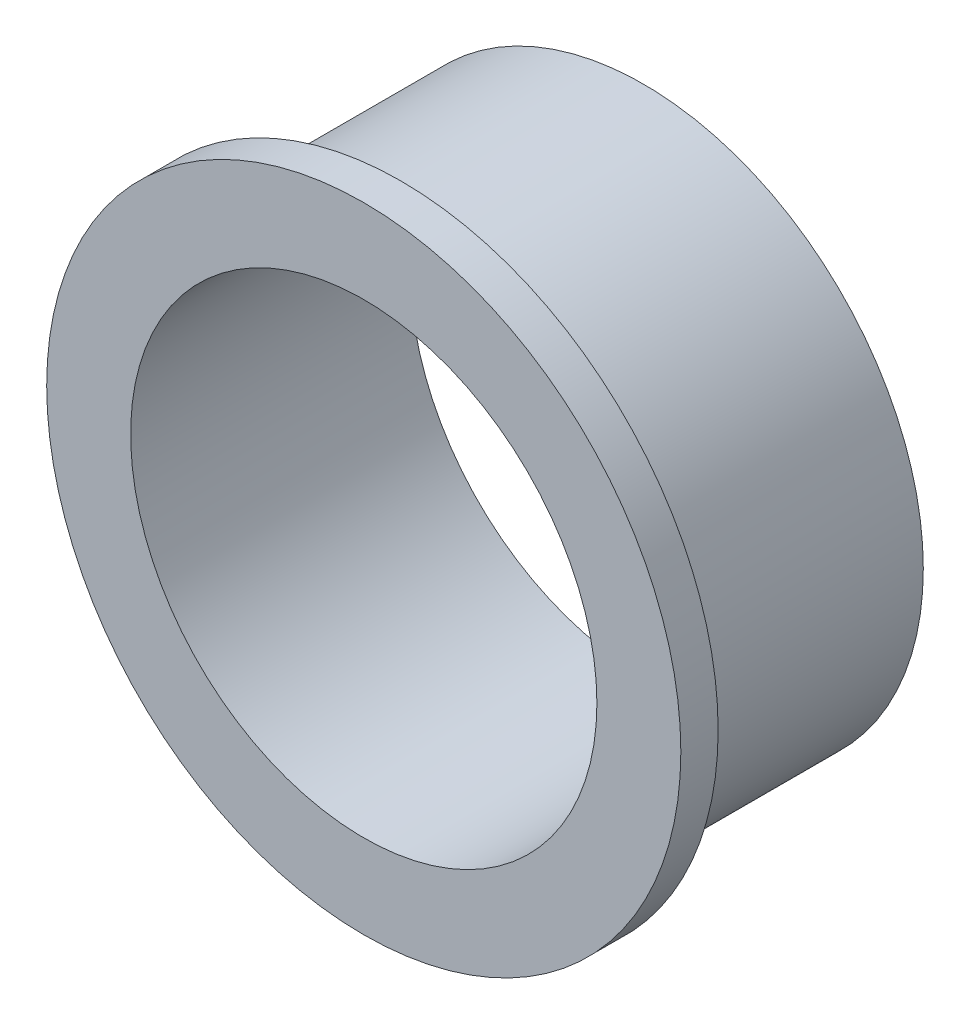
ISO-10303-21;
HEADER;
FILE_DESCRIPTION(('STEP AP214'),'2;1');
FILE_NAME('part.step','',(''),(''),'','','');
FILE_SCHEMA(('AUTOMOTIVE_DESIGN { 1 0 10303 214 1 1 1 1 }'));
ENDSEC;
DATA;
#1=APPLICATION_CONTEXT('core data for automotive mechanical design processes');
#2=APPLICATION_PROTOCOL_DEFINITION('international standard','automotive_design',2000,#1);
#3=PRODUCT_CONTEXT('',#1,'mechanical');
#4=PRODUCT('Part','Part','',(#3));
#5=PRODUCT_RELATED_PRODUCT_CATEGORY('part','',(#4));
#6=PRODUCT_DEFINITION_FORMATION('','',#4);
#7=PRODUCT_DEFINITION_CONTEXT('part definition',#1,'design');
#8=PRODUCT_DEFINITION('design','',#6,#7);
#9=PRODUCT_DEFINITION_SHAPE('','',#8);
#10=(LENGTH_UNIT() NAMED_UNIT(*) SI_UNIT(.MILLI.,.METRE.));
#11=(NAMED_UNIT(*) PLANE_ANGLE_UNIT() SI_UNIT($,.RADIAN.));
#12=(NAMED_UNIT(*) SI_UNIT($,.STERADIAN.) SOLID_ANGLE_UNIT());
#13=UNCERTAINTY_MEASURE_WITH_UNIT(LENGTH_MEASURE(1.E-05),#10,'distance_accuracy_value','');
#14=(GEOMETRIC_REPRESENTATION_CONTEXT(3) GLOBAL_UNCERTAINTY_ASSIGNED_CONTEXT((#13)) GLOBAL_UNIT_ASSIGNED_CONTEXT((#10,
#11,#12)) REPRESENTATION_CONTEXT('',''));
#15=CARTESIAN_POINT('',(0.,0.,0.));
#16=DIRECTION('',(0.,0.,1.));
#17=DIRECTION('',(1.,0.,0.));
#18=AXIS2_PLACEMENT_3D('',#15,#16,#17);
#19=CARTESIAN_POINT('',(0.,0.,15.));
#20=DIRECTION('',(0.,0.,-1.));
#21=DIRECTION('',(-1.,0.,0.));
#22=AXIS2_PLACEMENT_3D('',#19,#20,#21);
#23=CYLINDRICAL_SURFACE('',#22,15.);
#24=CARTESIAN_POINT('',(0.,0.,0.));
#25=DIRECTION('',(0.,0.,1.));
#26=DIRECTION('',(1.,0.,0.));
#27=AXIS2_PLACEMENT_3D('',#24,#25,#26);
#28=CIRCLE('',#27,15.);
#29=CARTESIAN_POINT('',(15.,0.,0.));
#30=VERTEX_POINT('',#29);
#31=EDGE_CURVE('E39',#30,#30,#28,.T.);
#32=ORIENTED_EDGE('',*,*,#31,.T.);
#33=EDGE_LOOP('',(#32));
#34=FACE_BOUND('',#33,.T.);
#35=CARTESIAN_POINT('',(0.,0.,13.));
#36=DIRECTION('',(0.,0.,1.));
#37=DIRECTION('',(1.,0.,0.));
#38=AXIS2_PLACEMENT_3D('',#35,#36,#37);
#39=CIRCLE('',#38,15.);
#40=CARTESIAN_POINT('',(15.,0.,13.));
#41=VERTEX_POINT('',#40);
#42=EDGE_CURVE('E10',#41,#41,#39,.T.);
#43=ORIENTED_EDGE('',*,*,#42,.F.);
#44=EDGE_LOOP('',(#43));
#45=FACE_BOUND('',#44,.T.);
#46=ADVANCED_FACE('F33',(#34,#45),#23,.T.);
#47=CARTESIAN_POINT('',(0.,0.,15.));
#48=DIRECTION('',(0.,0.,1.));
#49=DIRECTION('',(1.,0.,0.));
#50=AXIS2_PLACEMENT_3D('',#47,#48,#49);
#51=PLANE('',#50);
#52=CARTESIAN_POINT('',(0.,0.,15.));
#53=DIRECTION('',(0.,0.,1.));
#54=DIRECTION('',(1.,0.,0.));
#55=AXIS2_PLACEMENT_3D('',#52,#53,#54);
#56=CIRCLE('',#55,12.5);
#57=CARTESIAN_POINT('',(12.5,0.,15.));
#58=VERTEX_POINT('',#57);
#59=EDGE_CURVE('E43',#58,#58,#56,.T.);
#60=ORIENTED_EDGE('',*,*,#59,.F.);
#61=EDGE_LOOP('',(#60));
#62=FACE_BOUND('',#61,.T.);
#63=CARTESIAN_POINT('',(0.,0.,15.));
#64=DIRECTION('',(0.,0.,1.));
#65=DIRECTION('',(1.,0.,0.));
#66=AXIS2_PLACEMENT_3D('',#63,#64,#65);
#67=CIRCLE('',#66,17.);
#68=CARTESIAN_POINT('',(17.,0.,15.));
#69=VERTEX_POINT('',#68);
#70=EDGE_CURVE('E53',#69,#69,#67,.T.);
#71=ORIENTED_EDGE('',*,*,#70,.T.);
#72=EDGE_LOOP('',(#71));
#73=FACE_BOUND('',#72,.T.);
#74=ADVANCED_FACE('F71',(#62,#73),#51,.T.);
#75=CARTESIAN_POINT('',(0.,0.,0.));
#76=DIRECTION('',(0.,0.,1.));
#77=DIRECTION('',(1.,0.,0.));
#78=AXIS2_PLACEMENT_3D('',#75,#76,#77);
#79=PLANE('',#78);
#80=ORIENTED_EDGE('',*,*,#31,.F.);
#81=EDGE_LOOP('',(#80));
#82=FACE_BOUND('',#81,.T.);
#83=CARTESIAN_POINT('',(0.,0.,0.));
#84=DIRECTION('',(0.,0.,1.));
#85=DIRECTION('',(1.,0.,0.));
#86=AXIS2_PLACEMENT_3D('',#83,#84,#85);
#87=CIRCLE('',#86,12.5);
#88=CARTESIAN_POINT('',(12.5,0.,0.));
#89=VERTEX_POINT('',#88);
#90=EDGE_CURVE('E47',#89,#89,#87,.T.);
#91=ORIENTED_EDGE('',*,*,#90,.T.);
#92=EDGE_LOOP('',(#91));
#93=FACE_BOUND('',#92,.T.);
#94=ADVANCED_FACE('F75',(#82,#93),#79,.F.);
#95=CARTESIAN_POINT('',(0.,0.,15.));
#96=DIRECTION('',(0.,0.,-1.));
#97=DIRECTION('',(-1.,0.,0.));
#98=AXIS2_PLACEMENT_3D('',#95,#96,#97);
#99=CYLINDRICAL_SURFACE('',#98,12.5);
#100=ORIENTED_EDGE('',*,*,#59,.T.);
#101=EDGE_LOOP('',(#100));
#102=FACE_BOUND('',#101,.T.);
#103=ORIENTED_EDGE('',*,*,#90,.F.);
#104=EDGE_LOOP('',(#103));
#105=FACE_BOUND('',#104,.T.);
#106=ADVANCED_FACE('F68',(#102,#105),#99,.F.);
#107=CARTESIAN_POINT('',(0.,0.,13.));
#108=DIRECTION('',(0.,0.,1.));
#109=DIRECTION('',(1.,0.,0.));
#110=AXIS2_PLACEMENT_3D('',#107,#108,#109);
#111=CYLINDRICAL_SURFACE('',#110,17.);
#112=CARTESIAN_POINT('',(0.,0.,13.));
#113=DIRECTION('',(0.,0.,1.));
#114=DIRECTION('',(1.,0.,0.));
#115=AXIS2_PLACEMENT_3D('',#112,#113,#114);
#116=CIRCLE('',#115,17.);
#117=CARTESIAN_POINT('',(17.,0.,13.));
#118=VERTEX_POINT('',#117);
#119=EDGE_CURVE('E51',#118,#118,#116,.T.);
#120=ORIENTED_EDGE('',*,*,#119,.T.);
#121=EDGE_LOOP('',(#120));
#122=FACE_BOUND('',#121,.T.);
#123=ORIENTED_EDGE('',*,*,#70,.F.);
#124=EDGE_LOOP('',(#123));
#125=FACE_BOUND('',#124,.T.);
#126=ADVANCED_FACE('F59',(#122,#125),#111,.T.);
#127=CARTESIAN_POINT('',(0.,0.,13.));
#128=DIRECTION('',(0.,0.,1.));
#129=DIRECTION('',(1.,0.,0.));
#130=AXIS2_PLACEMENT_3D('',#127,#128,#129);
#131=PLANE('',#130);
#132=ORIENTED_EDGE('',*,*,#42,.T.);
#133=EDGE_LOOP('',(#132));
#134=FACE_BOUND('',#133,.T.);
#135=ORIENTED_EDGE('',*,*,#119,.F.);
#136=EDGE_LOOP('',(#135));
#137=FACE_BOUND('',#136,.T.);
#138=ADVANCED_FACE('F62',(#134,#137),#131,.F.);
#139=CLOSED_SHELL('',(#46,#74,#94,#106,#126,#138));
#140=MANIFOLD_SOLID_BREP('B2',#139);
#141=ADVANCED_BREP_SHAPE_REPRESENTATION('',(#18,#140),#14);
#142=SHAPE_DEFINITION_REPRESENTATION(#9,#141);
ENDSEC;
END-ISO-10303-21;
